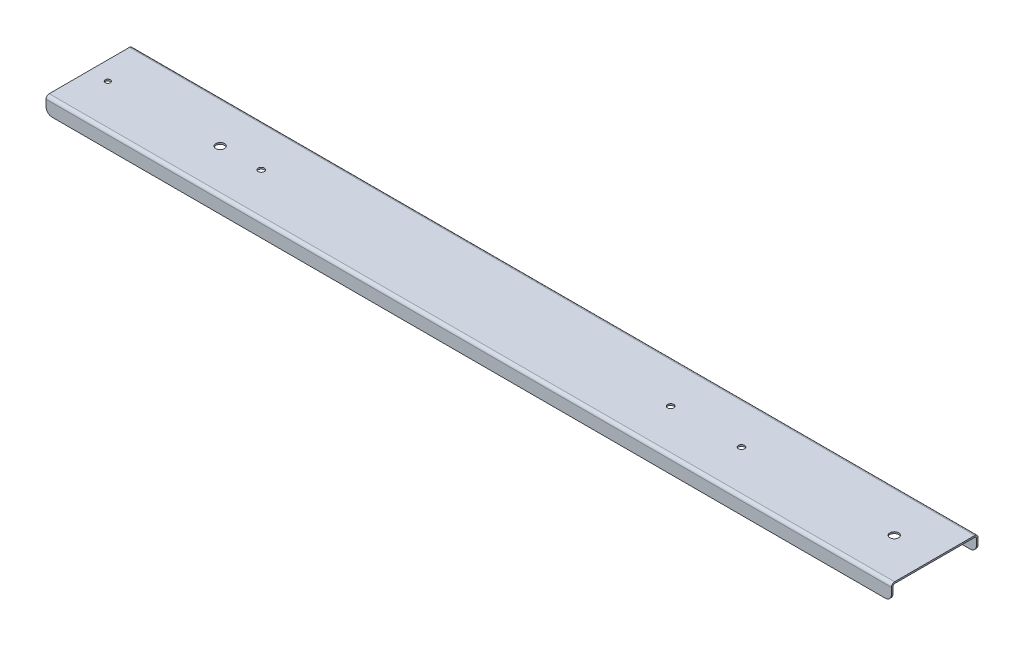
ISO-10303-21;
HEADER;
FILE_DESCRIPTION(('STEP AP214'),'2;1');
FILE_NAME('part.step','',(''),(''),'','','');
FILE_SCHEMA(('AUTOMOTIVE_DESIGN { 1 0 10303 214 1 1 1 1 }'));
ENDSEC;
DATA;
#1=APPLICATION_CONTEXT('core data for automotive mechanical design processes');
#2=APPLICATION_PROTOCOL_DEFINITION('international standard','automotive_design',2000,#1);
#3=PRODUCT_CONTEXT('',#1,'mechanical');
#4=PRODUCT('Part','Part','',(#3));
#5=PRODUCT_RELATED_PRODUCT_CATEGORY('part','',(#4));
#6=PRODUCT_DEFINITION_FORMATION('','',#4);
#7=PRODUCT_DEFINITION_CONTEXT('part definition',#1,'design');
#8=PRODUCT_DEFINITION('design','',#6,#7);
#9=PRODUCT_DEFINITION_SHAPE('','',#8);
#10=(LENGTH_UNIT() NAMED_UNIT(*) SI_UNIT(.MILLI.,.METRE.));
#11=(NAMED_UNIT(*) PLANE_ANGLE_UNIT() SI_UNIT($,.RADIAN.));
#12=(NAMED_UNIT(*) SI_UNIT($,.STERADIAN.) SOLID_ANGLE_UNIT());
#13=UNCERTAINTY_MEASURE_WITH_UNIT(LENGTH_MEASURE(1.E-05),#10,'distance_accuracy_value','');
#14=(GEOMETRIC_REPRESENTATION_CONTEXT(3) GLOBAL_UNCERTAINTY_ASSIGNED_CONTEXT((#13)) GLOBAL_UNIT_ASSIGNED_CONTEXT((#10,
#11,#12)) REPRESENTATION_CONTEXT('',''));
#15=CARTESIAN_POINT('',(0.,0.,0.));
#16=DIRECTION('',(0.,0.,1.));
#17=DIRECTION('',(1.,0.,0.));
#18=AXIS2_PLACEMENT_3D('',#15,#16,#17);
#19=CARTESIAN_POINT('',(290.49780007,-64.262,0.));
#20=DIRECTION('',(0.,1.,0.));
#21=DIRECTION('',(0.,0.,1.));
#22=AXIS2_PLACEMENT_3D('',#19,#20,#21);
#23=CYLINDRICAL_SURFACE('',#22,3.51);
#24=CARTESIAN_POINT('',(290.49780007,-1.291,0.));
#25=DIRECTION('',(0.,-1.,0.));
#26=DIRECTION('',(0.,0.,-1.));
#27=AXIS2_PLACEMENT_3D('',#24,#25,#26);
#28=CIRCLE('',#27,3.51);
#29=CARTESIAN_POINT('',(290.49780007,-1.291,-3.51));
#30=VERTEX_POINT('',#29);
#31=EDGE_CURVE('E359',#30,#30,#28,.T.);
#32=ORIENTED_EDGE('',*,*,#31,.T.);
#33=EDGE_LOOP('',(#32));
#34=FACE_BOUND('',#33,.T.);
#35=CARTESIAN_POINT('',(290.49780007,0.,0.));
#36=DIRECTION('',(0.,1.,0.));
#37=DIRECTION('',(0.,0.,1.));
#38=AXIS2_PLACEMENT_3D('',#35,#36,#37);
#39=CIRCLE('',#38,3.51);
#40=CARTESIAN_POINT('',(290.49780007,0.,3.51));
#41=VERTEX_POINT('',#40);
#42=EDGE_CURVE('E363',#41,#41,#39,.T.);
#43=ORIENTED_EDGE('',*,*,#42,.T.);
#44=EDGE_LOOP('',(#43));
#45=FACE_BOUND('',#44,.T.);
#46=ADVANCED_FACE('F50',(#34,#45),#23,.F.);
#47=CARTESIAN_POINT('',(-253.22220012,-64.262,0.));
#48=DIRECTION('',(0.,1.,0.));
#49=DIRECTION('',(0.,0.,1.));
#50=AXIS2_PLACEMENT_3D('',#47,#48,#49);
#51=CYLINDRICAL_SURFACE('',#50,3.51);
#52=CARTESIAN_POINT('',(-253.22220012,-1.291,0.));
#53=DIRECTION('',(0.,-1.,0.));
#54=DIRECTION('',(0.,0.,-1.));
#55=AXIS2_PLACEMENT_3D('',#52,#53,#54);
#56=CIRCLE('',#55,3.51);
#57=CARTESIAN_POINT('',(-253.22220012,-1.291,-3.51));
#58=VERTEX_POINT('',#57);
#59=EDGE_CURVE('E355',#58,#58,#56,.T.);
#60=ORIENTED_EDGE('',*,*,#59,.T.);
#61=EDGE_LOOP('',(#60));
#62=FACE_BOUND('',#61,.T.);
#63=CARTESIAN_POINT('',(-253.22220012,0.,0.));
#64=DIRECTION('',(0.,1.,0.));
#65=DIRECTION('',(0.,0.,1.));
#66=AXIS2_PLACEMENT_3D('',#63,#64,#65);
#67=CIRCLE('',#66,3.51);
#68=CARTESIAN_POINT('',(-253.22220012,0.,3.51));
#69=VERTEX_POINT('',#68);
#70=EDGE_CURVE('E329',#69,#69,#67,.T.);
#71=ORIENTED_EDGE('',*,*,#70,.T.);
#72=EDGE_LOOP('',(#71));
#73=FACE_BOUND('',#72,.T.);
#74=ADVANCED_FACE('F563',(#62,#73),#51,.F.);
#75=CARTESIAN_POINT('',(-353.775,-7.7,34.925));
#76=DIRECTION('',(0.,0.,-1.));
#77=DIRECTION('',(0.,1.,0.));
#78=AXIS2_PLACEMENT_3D('',#75,#76,#77);
#79=CYLINDRICAL_SURFACE('',#78,5.);
#80=CARTESIAN_POINT('',(-353.775,-7.7,34.925));
#81=DIRECTION('',(0.,0.,1.));
#82=DIRECTION('',(0.,-1.,0.));
#83=AXIS2_PLACEMENT_3D('',#80,#81,#82);
#84=CIRCLE('',#83,5.);
#85=CARTESIAN_POINT('',(-358.775,-7.7,34.925));
#86=VERTEX_POINT('',#85);
#87=CARTESIAN_POINT('',(-353.775,-12.7,34.925));
#88=VERTEX_POINT('',#87);
#89=EDGE_CURVE('E257',#86,#88,#84,.T.);
#90=ORIENTED_EDGE('',*,*,#89,.F.);
#91=DIRECTION('',(0.,0.,1.));
#92=VECTOR('',#91,1.);
#93=CARTESIAN_POINT('',(-358.775,-7.7,34.925));
#94=LINE('',#93,#92);
#95=CARTESIAN_POINT('',(-358.775,-7.7,33.634));
#96=VERTEX_POINT('',#95);
#97=EDGE_CURVE('E277',#96,#86,#94,.T.);
#98=ORIENTED_EDGE('',*,*,#97,.F.);
#99=CARTESIAN_POINT('',(-353.775,-7.7,33.634));
#100=DIRECTION('',(0.,0.,-1.));
#101=DIRECTION('',(0.,-1.,0.));
#102=AXIS2_PLACEMENT_3D('',#99,#100,#101);
#103=CIRCLE('',#102,5.);
#104=CARTESIAN_POINT('',(-353.775,-12.7,33.634));
#105=VERTEX_POINT('',#104);
#106=EDGE_CURVE('E244',#105,#96,#103,.T.);
#107=ORIENTED_EDGE('',*,*,#106,.F.);
#108=DIRECTION('',(0.,0.,-1.));
#109=VECTOR('',#108,1.);
#110=CARTESIAN_POINT('',(-353.775,-12.7,34.925));
#111=LINE('',#110,#109);
#112=EDGE_CURVE('E237',#88,#105,#111,.T.);
#113=ORIENTED_EDGE('',*,*,#112,.F.);
#114=EDGE_LOOP('',(#90,#98,#107,#113));
#115=FACE_BOUND('',#114,.T.);
#116=ADVANCED_FACE('F569',(#115),#79,.T.);
#117=CARTESIAN_POINT('',(-353.775,-7.7,-34.925));
#118=DIRECTION('',(0.,0.,1.));
#119=DIRECTION('',(0.,-1.,0.));
#120=AXIS2_PLACEMENT_3D('',#117,#118,#119);
#121=CYLINDRICAL_SURFACE('',#120,5.);
#122=CARTESIAN_POINT('',(-353.775,-7.7,-34.925));
#123=DIRECTION('',(0.,0.,-1.));
#124=DIRECTION('',(0.,1.,0.));
#125=AXIS2_PLACEMENT_3D('',#122,#123,#124);
#126=CIRCLE('',#125,5.);
#127=CARTESIAN_POINT('',(-353.775,-12.7,-34.925));
#128=VERTEX_POINT('',#127);
#129=CARTESIAN_POINT('',(-358.775,-7.7,-34.925));
#130=VERTEX_POINT('',#129);
#131=EDGE_CURVE('E159',#128,#130,#126,.T.);
#132=ORIENTED_EDGE('',*,*,#131,.F.);
#133=DIRECTION('',(0.,0.,-1.));
#134=VECTOR('',#133,1.);
#135=CARTESIAN_POINT('',(-353.775,-12.7,-34.925));
#136=LINE('',#135,#134);
#137=CARTESIAN_POINT('',(-353.775,-12.7,-33.634));
#138=VERTEX_POINT('',#137);
#139=EDGE_CURVE('E146',#138,#128,#136,.T.);
#140=ORIENTED_EDGE('',*,*,#139,.F.);
#141=CARTESIAN_POINT('',(-353.775,-7.7,-33.634));
#142=DIRECTION('',(0.,0.,1.));
#143=DIRECTION('',(0.,1.,0.));
#144=AXIS2_PLACEMENT_3D('',#141,#142,#143);
#145=CIRCLE('',#144,5.);
#146=CARTESIAN_POINT('',(-358.775,-7.7,-33.634));
#147=VERTEX_POINT('',#146);
#148=EDGE_CURVE('E183',#147,#138,#145,.T.);
#149=ORIENTED_EDGE('',*,*,#148,.F.);
#150=DIRECTION('',(0.,0.,1.));
#151=VECTOR('',#150,1.);
#152=CARTESIAN_POINT('',(-358.775,-7.7,-34.925));
#153=LINE('',#152,#151);
#154=EDGE_CURVE('E162',#130,#147,#153,.T.);
#155=ORIENTED_EDGE('',*,*,#154,.F.);
#156=EDGE_LOOP('',(#132,#140,#149,#155));
#157=FACE_BOUND('',#156,.T.);
#158=ADVANCED_FACE('F160',(#157),#121,.T.);
#159=CARTESIAN_POINT('',(318.088,-7.70000000000025,-38.1));
#160=DIRECTION('',(0.,0.,1.));
#161=DIRECTION('',(0.,-1.,0.));
#162=AXIS2_PLACEMENT_3D('',#159,#160,#161);
#163=CYLINDRICAL_SURFACE('',#162,5.);
#164=CARTESIAN_POINT('',(318.088,-7.7,34.925));
#165=DIRECTION('',(0.,0.,1.));
#166=DIRECTION('',(0.,-1.,0.));
#167=AXIS2_PLACEMENT_3D('',#164,#165,#166);
#168=CIRCLE('',#167,5.);
#169=CARTESIAN_POINT('',(318.088,-12.7,34.925));
#170=VERTEX_POINT('',#169);
#171=CARTESIAN_POINT('',(323.088,-7.7,34.925));
#172=VERTEX_POINT('',#171);
#173=EDGE_CURVE('E265',#170,#172,#168,.T.);
#174=ORIENTED_EDGE('',*,*,#173,.F.);
#175=DIRECTION('',(0.,0.,1.));
#176=VECTOR('',#175,1.);
#177=CARTESIAN_POINT('',(318.088,-12.7,34.925));
#178=LINE('',#177,#176);
#179=CARTESIAN_POINT('',(318.088,-12.7,33.634));
#180=VERTEX_POINT('',#179);
#181=EDGE_CURVE('E241',#180,#170,#178,.T.);
#182=ORIENTED_EDGE('',*,*,#181,.F.);
#183=CARTESIAN_POINT('',(318.088,-7.7,33.634));
#184=DIRECTION('',(0.,0.,-1.));
#185=DIRECTION('',(0.,-1.,0.));
#186=AXIS2_PLACEMENT_3D('',#183,#184,#185);
#187=CIRCLE('',#186,5.);
#188=CARTESIAN_POINT('',(323.088,-7.7,33.634));
#189=VERTEX_POINT('',#188);
#190=EDGE_CURVE('E252',#189,#180,#187,.T.);
#191=ORIENTED_EDGE('',*,*,#190,.F.);
#192=DIRECTION('',(0.,0.,-1.));
#193=VECTOR('',#192,1.);
#194=CARTESIAN_POINT('',(323.088,-7.7,33.634));
#195=LINE('',#194,#193);
#196=EDGE_CURVE('E11',#172,#189,#195,.T.);
#197=ORIENTED_EDGE('',*,*,#196,.F.);
#198=EDGE_LOOP('',(#174,#182,#191,#197));
#199=FACE_BOUND('',#198,.T.);
#200=ADVANCED_FACE('F546',(#199),#163,.T.);
#201=CARTESIAN_POINT('',(318.088,-7.7,-38.1));
#202=DIRECTION('',(0.,0.,1.));
#203=DIRECTION('',(0.,-1.,0.));
#204=AXIS2_PLACEMENT_3D('',#201,#202,#203);
#205=CYLINDRICAL_SURFACE('',#204,5.);
#206=CARTESIAN_POINT('',(318.088,-7.7,-33.634));
#207=DIRECTION('',(0.,0.,1.));
#208=DIRECTION('',(0.,1.,0.));
#209=AXIS2_PLACEMENT_3D('',#206,#207,#208);
#210=CIRCLE('',#209,5.);
#211=CARTESIAN_POINT('',(318.088,-12.7,-33.634));
#212=VERTEX_POINT('',#211);
#213=CARTESIAN_POINT('',(323.088,-7.7,-33.634));
#214=VERTEX_POINT('',#213);
#215=EDGE_CURVE('E184',#212,#214,#210,.T.);
#216=ORIENTED_EDGE('',*,*,#215,.F.);
#217=DIRECTION('',(0.,0.,1.));
#218=VECTOR('',#217,1.);
#219=CARTESIAN_POINT('',(318.088,-12.7,-33.634));
#220=LINE('',#219,#218);
#221=CARTESIAN_POINT('',(318.088,-12.7,-34.925));
#222=VERTEX_POINT('',#221);
#223=EDGE_CURVE('E85',#222,#212,#220,.T.);
#224=ORIENTED_EDGE('',*,*,#223,.F.);
#225=CARTESIAN_POINT('',(318.088,-7.7,-34.925));
#226=DIRECTION('',(0.,0.,-1.));
#227=DIRECTION('',(0.,1.,0.));
#228=AXIS2_PLACEMENT_3D('',#225,#226,#227);
#229=CIRCLE('',#228,5.);
#230=CARTESIAN_POINT('',(323.088,-7.7,-34.925));
#231=VERTEX_POINT('',#230);
#232=EDGE_CURVE('E169',#231,#222,#229,.T.);
#233=ORIENTED_EDGE('',*,*,#232,.F.);
#234=DIRECTION('',(0.,0.,-1.));
#235=VECTOR('',#234,1.);
#236=CARTESIAN_POINT('',(323.088,-7.7,-34.925));
#237=LINE('',#236,#235);
#238=EDGE_CURVE('E59',#214,#231,#237,.T.);
#239=ORIENTED_EDGE('',*,*,#238,.F.);
#240=EDGE_LOOP('',(#216,#224,#233,#239));
#241=FACE_BOUND('',#240,.T.);
#242=ADVANCED_FACE('F197',(#241),#205,.T.);
#243=CARTESIAN_POINT('',(110.105000008,0.,0.));
#244=DIRECTION('',(0.,1.,0.));
#245=DIRECTION('',(0.,0.,1.));
#246=AXIS2_PLACEMENT_3D('',#243,#244,#245);
#247=CYLINDRICAL_SURFACE('',#246,2.4892);
#248=CARTESIAN_POINT('',(110.105000008,-1.291,0.));
#249=DIRECTION('',(0.,-1.,0.));
#250=DIRECTION('',(0.,0.,-1.));
#251=AXIS2_PLACEMENT_3D('',#248,#249,#250);
#252=CIRCLE('',#251,2.4892);
#253=CARTESIAN_POINT('',(110.105000008,-1.291,-2.4892));
#254=VERTEX_POINT('',#253);
#255=EDGE_CURVE('E353',#254,#254,#252,.T.);
#256=ORIENTED_EDGE('',*,*,#255,.T.);
#257=EDGE_LOOP('',(#256));
#258=FACE_BOUND('',#257,.T.);
#259=CARTESIAN_POINT('',(110.105000008,0.,0.));
#260=DIRECTION('',(0.,1.,0.));
#261=DIRECTION('',(0.,0.,1.));
#262=AXIS2_PLACEMENT_3D('',#259,#260,#261);
#263=CIRCLE('',#262,2.4892);
#264=CARTESIAN_POINT('',(110.105000008,0.,2.4892));
#265=VERTEX_POINT('',#264);
#266=EDGE_CURVE('E325',#265,#265,#263,.T.);
#267=ORIENTED_EDGE('',*,*,#266,.T.);
#268=EDGE_LOOP('',(#267));
#269=FACE_BOUND('',#268,.T.);
#270=ADVANCED_FACE('F734',(#258,#269),#247,.F.);
#271=CARTESIAN_POINT('',(167.255000008,0.,0.));
#272=DIRECTION('',(0.,1.,0.));
#273=DIRECTION('',(0.,0.,1.));
#274=AXIS2_PLACEMENT_3D('',#271,#272,#273);
#275=CYLINDRICAL_SURFACE('',#274,2.4892);
#276=CARTESIAN_POINT('',(167.255000008,-1.291,0.));
#277=DIRECTION('',(0.,-1.,0.));
#278=DIRECTION('',(0.,0.,-1.));
#279=AXIS2_PLACEMENT_3D('',#276,#277,#278);
#280=CIRCLE('',#279,2.4892);
#281=CARTESIAN_POINT('',(167.255000008,-1.291,-2.4892));
#282=VERTEX_POINT('',#281);
#283=EDGE_CURVE('E346',#282,#282,#280,.T.);
#284=ORIENTED_EDGE('',*,*,#283,.T.);
#285=EDGE_LOOP('',(#284));
#286=FACE_BOUND('',#285,.T.);
#287=CARTESIAN_POINT('',(167.255000008,0.,0.));
#288=DIRECTION('',(0.,1.,0.));
#289=DIRECTION('',(0.,0.,1.));
#290=AXIS2_PLACEMENT_3D('',#287,#288,#289);
#291=CIRCLE('',#290,2.4892);
#292=CARTESIAN_POINT('',(167.255000008,0.,2.4892));
#293=VERTEX_POINT('',#292);
#294=EDGE_CURVE('E319',#293,#293,#291,.T.);
#295=ORIENTED_EDGE('',*,*,#294,.T.);
#296=EDGE_LOOP('',(#295));
#297=FACE_BOUND('',#296,.T.);
#298=ADVANCED_FACE('F723',(#286,#297),#275,.F.);
#299=CARTESIAN_POINT('',(-220.094999992,0.,0.));
#300=DIRECTION('',(0.,1.,0.));
#301=DIRECTION('',(0.,0.,1.));
#302=AXIS2_PLACEMENT_3D('',#299,#300,#301);
#303=CYLINDRICAL_SURFACE('',#302,2.4892);
#304=CARTESIAN_POINT('',(-220.094999992,-1.291,0.));
#305=DIRECTION('',(0.,-1.,0.));
#306=DIRECTION('',(0.,0.,-1.));
#307=AXIS2_PLACEMENT_3D('',#304,#305,#306);
#308=CIRCLE('',#307,2.4892);
#309=CARTESIAN_POINT('',(-220.094999992,-1.291,-2.48919999999996));
#310=VERTEX_POINT('',#309);
#311=EDGE_CURVE('E335',#310,#310,#308,.T.);
#312=ORIENTED_EDGE('',*,*,#311,.T.);
#313=EDGE_LOOP('',(#312));
#314=FACE_BOUND('',#313,.T.);
#315=CARTESIAN_POINT('',(-220.094999992,0.,0.));
#316=DIRECTION('',(0.,1.,0.));
#317=DIRECTION('',(0.,0.,1.));
#318=AXIS2_PLACEMENT_3D('',#315,#316,#317);
#319=CIRCLE('',#318,2.4892);
#320=CARTESIAN_POINT('',(-220.094999992,0.,2.48920000000004));
#321=VERTEX_POINT('',#320);
#322=EDGE_CURVE('E315',#321,#321,#319,.T.);
#323=ORIENTED_EDGE('',*,*,#322,.T.);
#324=EDGE_LOOP('',(#323));
#325=FACE_BOUND('',#324,.T.);
#326=ADVANCED_FACE('F713',(#314,#325),#303,.F.);
#327=CARTESIAN_POINT('',(323.088,0.,-38.1));
#328=DIRECTION('',(-1.,0.,0.));
#329=DIRECTION('',(0.,0.,1.));
#330=AXIS2_PLACEMENT_3D('',#327,#328,#329);
#331=PLANE('',#330);
#332=DIRECTION('',(0.,1.,0.));
#333=VECTOR('',#332,1.);
#334=CARTESIAN_POINT('',(323.088,1.27447209883755E-13,-33.634));
#335=LINE('',#334,#333);
#336=CARTESIAN_POINT('',(323.088,-2.582,-33.634));
#337=VERTEX_POINT('',#336);
#338=EDGE_CURVE('E180',#214,#337,#335,.T.);
#339=ORIENTED_EDGE('',*,*,#338,.F.);
#340=ORIENTED_EDGE('',*,*,#238,.T.);
#341=DIRECTION('',(0.,1.,0.));
#342=VECTOR('',#341,1.);
#343=CARTESIAN_POINT('',(323.088,1.31954712292201E-13,-34.925));
#344=LINE('',#343,#342);
#345=CARTESIAN_POINT('',(323.088,-2.582,-34.925));
#346=VERTEX_POINT('',#345);
#347=EDGE_CURVE('E175',#231,#346,#344,.T.);
#348=ORIENTED_EDGE('',*,*,#347,.T.);
#349=CARTESIAN_POINT('',(323.088,-2.582,-32.343));
#350=DIRECTION('',(1.,0.,0.));
#351=DIRECTION('',(0.,0.,1.));
#352=AXIS2_PLACEMENT_3D('',#349,#350,#351);
#353=CIRCLE('',#352,2.582);
#354=CARTESIAN_POINT('',(323.088,0.,-32.343));
#355=VERTEX_POINT('',#354);
#356=EDGE_CURVE('E221',#346,#355,#353,.T.);
#357=ORIENTED_EDGE('',*,*,#356,.T.);
#358=DIRECTION('',(0.,0.,-1.));
#359=VECTOR('',#358,1.);
#360=CARTESIAN_POINT('',(323.088,0.,-38.1));
#361=LINE('',#360,#359);
#362=CARTESIAN_POINT('',(323.088,0.,32.343));
#363=VERTEX_POINT('',#362);
#364=EDGE_CURVE('E334',#363,#355,#361,.T.);
#365=ORIENTED_EDGE('',*,*,#364,.F.);
#366=CARTESIAN_POINT('',(323.088,-2.582,32.343));
#367=DIRECTION('',(1.,0.,0.));
#368=DIRECTION('',(0.,0.,1.));
#369=AXIS2_PLACEMENT_3D('',#366,#367,#368);
#370=CIRCLE('',#369,2.582);
#371=CARTESIAN_POINT('',(323.088,-2.582,34.925));
#372=VERTEX_POINT('',#371);
#373=EDGE_CURVE('E291',#363,#372,#370,.T.);
#374=ORIENTED_EDGE('',*,*,#373,.T.);
#375=DIRECTION('',(0.,-1.,0.));
#376=VECTOR('',#375,1.);
#377=CARTESIAN_POINT('',(323.088,1.31954712292201E-13,34.925));
#378=LINE('',#377,#376);
#379=EDGE_CURVE('E261',#372,#172,#378,.T.);
#380=ORIENTED_EDGE('',*,*,#379,.T.);
#381=ORIENTED_EDGE('',*,*,#196,.T.);
#382=DIRECTION('',(0.,-1.,0.));
#383=VECTOR('',#382,1.);
#384=CARTESIAN_POINT('',(323.088,1.27447209883755E-13,33.634));
#385=LINE('',#384,#383);
#386=CARTESIAN_POINT('',(323.088,-2.582,33.634));
#387=VERTEX_POINT('',#386);
#388=EDGE_CURVE('E253',#387,#189,#385,.T.);
#389=ORIENTED_EDGE('',*,*,#388,.F.);
#390=CARTESIAN_POINT('',(323.088,-2.582,32.343));
#391=DIRECTION('',(1.,0.,0.));
#392=DIRECTION('',(0.,0.,1.));
#393=AXIS2_PLACEMENT_3D('',#390,#391,#392);
#394=CIRCLE('',#393,1.291);
#395=CARTESIAN_POINT('',(323.088,-1.291,32.343));
#396=VERTEX_POINT('',#395);
#397=EDGE_CURVE('E286',#396,#387,#394,.T.);
#398=ORIENTED_EDGE('',*,*,#397,.F.);
#399=DIRECTION('',(0.,0.,-1.));
#400=VECTOR('',#399,1.);
#401=CARTESIAN_POINT('',(323.088,-1.291,0.));
#402=LINE('',#401,#400);
#403=CARTESIAN_POINT('',(323.088,-1.291,-32.343));
#404=VERTEX_POINT('',#403);
#405=EDGE_CURVE('E391',#396,#404,#402,.T.);
#406=ORIENTED_EDGE('',*,*,#405,.T.);
#407=CARTESIAN_POINT('',(323.088,-2.582,-32.343));
#408=DIRECTION('',(1.,0.,0.));
#409=DIRECTION('',(0.,0.,1.));
#410=AXIS2_PLACEMENT_3D('',#407,#408,#409);
#411=CIRCLE('',#410,1.291);
#412=EDGE_CURVE('E217',#337,#404,#411,.T.);
#413=ORIENTED_EDGE('',*,*,#412,.F.);
#414=EDGE_LOOP('',(#339,#340,#348,#357,#365,#374,#380,#381,#389,#398,#406,#413));
#415=FACE_BOUND('',#414,.T.);
#416=ADVANCED_FACE('F192',(#415),#331,.F.);
#417=CARTESIAN_POINT('',(358.775,-12.7,-34.925));
#418=DIRECTION('',(0.,-1.,0.));
#419=DIRECTION('',(0.,0.,-1.));
#420=AXIS2_PLACEMENT_3D('',#417,#418,#419);
#421=PLANE('',#420);
#422=DIRECTION('',(1.,0.,0.));
#423=VECTOR('',#422,1.);
#424=CARTESIAN_POINT('',(358.775,-12.7,-34.925));
#425=LINE('',#424,#423);
#426=EDGE_CURVE('E150',#128,#222,#425,.T.);
#427=ORIENTED_EDGE('',*,*,#426,.T.);
#428=ORIENTED_EDGE('',*,*,#223,.T.);
#429=DIRECTION('',(1.,0.,0.));
#430=VECTOR('',#429,1.);
#431=CARTESIAN_POINT('',(0.,-12.7,-33.634));
#432=LINE('',#431,#430);
#433=EDGE_CURVE('E153',#138,#212,#432,.T.);
#434=ORIENTED_EDGE('',*,*,#433,.F.);
#435=ORIENTED_EDGE('',*,*,#139,.T.);
#436=EDGE_LOOP('',(#427,#428,#434,#435));
#437=FACE_BOUND('',#436,.T.);
#438=ADVANCED_FACE('F148',(#437),#421,.T.);
#439=CARTESIAN_POINT('',(0.,1.27447209883755E-13,-33.634));
#440=DIRECTION('',(0.,0.,-1.));
#441=DIRECTION('',(-1.,0.,0.));
#442=AXIS2_PLACEMENT_3D('',#439,#440,#441);
#443=PLANE('',#442);
#444=ORIENTED_EDGE('',*,*,#433,.T.);
#445=ORIENTED_EDGE('',*,*,#215,.T.);
#446=ORIENTED_EDGE('',*,*,#338,.T.);
#447=DIRECTION('',(1.,0.,0.));
#448=VECTOR('',#447,1.);
#449=CARTESIAN_POINT('',(-358.775,-2.582,-33.634));
#450=LINE('',#449,#448);
#451=CARTESIAN_POINT('',(-358.775,-2.582,-33.634));
#452=VERTEX_POINT('',#451);
#453=EDGE_CURVE('E220',#452,#337,#450,.T.);
#454=ORIENTED_EDGE('',*,*,#453,.F.);
#455=DIRECTION('',(0.,-1.,0.));
#456=VECTOR('',#455,1.);
#457=CARTESIAN_POINT('',(-358.775,-5.10947450533963E-12,-33.634));
#458=LINE('',#457,#456);
#459=EDGE_CURVE('E202',#452,#147,#458,.T.);
#460=ORIENTED_EDGE('',*,*,#459,.T.);
#461=ORIENTED_EDGE('',*,*,#148,.T.);
#462=EDGE_LOOP('',(#444,#445,#446,#454,#460,#461));
#463=FACE_BOUND('',#462,.T.);
#464=ADVANCED_FACE('F685',(#463),#443,.F.);
#465=CARTESIAN_POINT('',(0.,1.31954712292201E-13,-34.925));
#466=DIRECTION('',(0.,0.,-1.));
#467=DIRECTION('',(-1.,0.,0.));
#468=AXIS2_PLACEMENT_3D('',#465,#466,#467);
#469=PLANE('',#468);
#470=ORIENTED_EDGE('',*,*,#347,.F.);
#471=ORIENTED_EDGE('',*,*,#232,.T.);
#472=ORIENTED_EDGE('',*,*,#426,.F.);
#473=ORIENTED_EDGE('',*,*,#131,.T.);
#474=DIRECTION('',(0.,-1.,0.));
#475=VECTOR('',#474,1.);
#476=CARTESIAN_POINT('',(-358.775,-12.7,-34.925));
#477=LINE('',#476,#475);
#478=CARTESIAN_POINT('',(-358.775,-2.582,-34.925));
#479=VERTEX_POINT('',#478);
#480=EDGE_CURVE('E212',#479,#130,#477,.T.);
#481=ORIENTED_EDGE('',*,*,#480,.F.);
#482=DIRECTION('',(1.,0.,0.));
#483=VECTOR('',#482,1.);
#484=CARTESIAN_POINT('',(0.,-2.582,-34.925));
#485=LINE('',#484,#483);
#486=EDGE_CURVE('E199',#479,#346,#485,.T.);
#487=ORIENTED_EDGE('',*,*,#486,.T.);
#488=EDGE_LOOP('',(#470,#471,#472,#473,#481,#487));
#489=FACE_BOUND('',#488,.T.);
#490=ADVANCED_FACE('F168',(#489),#469,.T.);
#491=CARTESIAN_POINT('',(-358.775,-12.7,-34.925));
#492=DIRECTION('',(-1.,0.,0.));
#493=DIRECTION('',(0.,1.,0.));
#494=AXIS2_PLACEMENT_3D('',#491,#492,#493);
#495=PLANE('',#494);
#496=ORIENTED_EDGE('',*,*,#480,.T.);
#497=ORIENTED_EDGE('',*,*,#154,.T.);
#498=ORIENTED_EDGE('',*,*,#459,.F.);
#499=DIRECTION('',(0.,0.,-1.));
#500=VECTOR('',#499,1.);
#501=CARTESIAN_POINT('',(-358.775,-2.582,-34.925));
#502=LINE('',#501,#500);
#503=EDGE_CURVE('E234',#452,#479,#502,.T.);
#504=ORIENTED_EDGE('',*,*,#503,.T.);
#505=EDGE_LOOP('',(#496,#497,#498,#504));
#506=FACE_BOUND('',#505,.T.);
#507=ADVANCED_FACE('F665',(#506),#495,.T.);
#508=CARTESIAN_POINT('',(358.775,-2.582,-32.343));
#509=DIRECTION('',(1.,0.,0.));
#510=DIRECTION('',(0.,0.,-1.));
#511=AXIS2_PLACEMENT_3D('',#508,#509,#510);
#512=CYLINDRICAL_SURFACE('',#511,1.291);
#513=ORIENTED_EDGE('',*,*,#453,.T.);
#514=ORIENTED_EDGE('',*,*,#412,.T.);
#515=DIRECTION('',(-1.,0.,0.));
#516=VECTOR('',#515,1.);
#517=CARTESIAN_POINT('',(358.775,-1.291,-32.343));
#518=LINE('',#517,#516);
#519=CARTESIAN_POINT('',(-358.775,-1.291,-32.343));
#520=VERTEX_POINT('',#519);
#521=EDGE_CURVE('E370',#404,#520,#518,.T.);
#522=ORIENTED_EDGE('',*,*,#521,.T.);
#523=CARTESIAN_POINT('',(-358.775,-2.582,-32.343));
#524=DIRECTION('',(-1.,0.,0.));
#525=DIRECTION('',(0.,0.,-1.));
#526=AXIS2_PLACEMENT_3D('',#523,#524,#525);
#527=CIRCLE('',#526,1.291);
#528=EDGE_CURVE('E230',#520,#452,#527,.T.);
#529=ORIENTED_EDGE('',*,*,#528,.T.);
#530=EDGE_LOOP('',(#513,#514,#522,#529));
#531=FACE_BOUND('',#530,.T.);
#532=ADVANCED_FACE('F654',(#531),#512,.F.);
#533=CARTESIAN_POINT('',(358.775,-2.582,-32.343));
#534=DIRECTION('',(1.,0.,0.));
#535=DIRECTION('',(0.,0.,-1.));
#536=AXIS2_PLACEMENT_3D('',#533,#534,#535);
#537=CYLINDRICAL_SURFACE('',#536,2.582);
#538=ORIENTED_EDGE('',*,*,#356,.F.);
#539=ORIENTED_EDGE('',*,*,#486,.F.);
#540=CARTESIAN_POINT('',(-358.775,-2.582,-32.343));
#541=DIRECTION('',(-1.,0.,0.));
#542=DIRECTION('',(0.,0.,-1.));
#543=AXIS2_PLACEMENT_3D('',#540,#541,#542);
#544=CIRCLE('',#543,2.582);
#545=CARTESIAN_POINT('',(-358.775,0.,-32.343));
#546=VERTEX_POINT('',#545);
#547=EDGE_CURVE('E224',#546,#479,#544,.T.);
#548=ORIENTED_EDGE('',*,*,#547,.F.);
#549=DIRECTION('',(-1.,0.,0.));
#550=VECTOR('',#549,1.);
#551=CARTESIAN_POINT('',(358.775,0.,-32.343));
#552=LINE('',#551,#550);
#553=EDGE_CURVE('E342',#355,#546,#552,.T.);
#554=ORIENTED_EDGE('',*,*,#553,.F.);
#555=EDGE_LOOP('',(#538,#539,#548,#554));
#556=FACE_BOUND('',#555,.T.);
#557=ADVANCED_FACE('F642',(#556),#537,.T.);
#558=CARTESIAN_POINT('',(-358.775,-2.582,-32.343));
#559=DIRECTION('',(-1.,0.,0.));
#560=DIRECTION('',(0.,0.,1.));
#561=AXIS2_PLACEMENT_3D('',#558,#559,#560);
#562=PLANE('',#561);
#563=ORIENTED_EDGE('',*,*,#503,.F.);
#564=ORIENTED_EDGE('',*,*,#528,.F.);
#565=DIRECTION('',(0.,1.,0.));
#566=VECTOR('',#565,1.);
#567=CARTESIAN_POINT('',(-358.775,-1.291,-32.343));
#568=LINE('',#567,#566);
#569=EDGE_CURVE('E311',#520,#546,#568,.T.);
#570=ORIENTED_EDGE('',*,*,#569,.T.);
#571=ORIENTED_EDGE('',*,*,#547,.T.);
#572=EDGE_LOOP('',(#563,#564,#570,#571));
#573=FACE_BOUND('',#572,.T.);
#574=ADVANCED_FACE('F637',(#573),#562,.T.);
#575=CARTESIAN_POINT('',(-358.775,-12.7,34.925));
#576=DIRECTION('',(0.,-1.,0.));
#577=DIRECTION('',(-1.,0.,0.));
#578=AXIS2_PLACEMENT_3D('',#575,#576,#577);
#579=PLANE('',#578);
#580=DIRECTION('',(-1.,0.,0.));
#581=VECTOR('',#580,1.);
#582=CARTESIAN_POINT('',(0.,-12.7,33.634));
#583=LINE('',#582,#581);
#584=EDGE_CURVE('E248',#180,#105,#583,.T.);
#585=ORIENTED_EDGE('',*,*,#584,.F.);
#586=ORIENTED_EDGE('',*,*,#181,.T.);
#587=DIRECTION('',(-1.,0.,0.));
#588=VECTOR('',#587,1.);
#589=CARTESIAN_POINT('',(-358.775,-12.7,34.925));
#590=LINE('',#589,#588);
#591=EDGE_CURVE('E269',#170,#88,#590,.T.);
#592=ORIENTED_EDGE('',*,*,#591,.T.);
#593=ORIENTED_EDGE('',*,*,#112,.T.);
#594=EDGE_LOOP('',(#585,#586,#592,#593));
#595=FACE_BOUND('',#594,.T.);
#596=ADVANCED_FACE('F542',(#595),#579,.T.);
#597=CARTESIAN_POINT('',(0.,1.27447209883755E-13,33.634));
#598=DIRECTION('',(0.,0.,1.));
#599=DIRECTION('',(0.,-1.,0.));
#600=AXIS2_PLACEMENT_3D('',#597,#598,#599);
#601=PLANE('',#600);
#602=ORIENTED_EDGE('',*,*,#388,.T.);
#603=ORIENTED_EDGE('',*,*,#190,.T.);
#604=ORIENTED_EDGE('',*,*,#584,.T.);
#605=ORIENTED_EDGE('',*,*,#106,.T.);
#606=DIRECTION('',(0.,1.,0.));
#607=VECTOR('',#606,1.);
#608=CARTESIAN_POINT('',(-358.775,-3.3638339335985E-12,33.634));
#609=LINE('',#608,#607);
#610=CARTESIAN_POINT('',(-358.775,-2.582,33.634));
#611=VERTEX_POINT('',#610);
#612=EDGE_CURVE('E281',#96,#611,#609,.T.);
#613=ORIENTED_EDGE('',*,*,#612,.T.);
#614=DIRECTION('',(-1.,0.,0.));
#615=VECTOR('',#614,1.);
#616=CARTESIAN_POINT('',(358.775,-2.582,33.634));
#617=LINE('',#616,#615);
#618=EDGE_CURVE('E282',#387,#611,#617,.T.);
#619=ORIENTED_EDGE('',*,*,#618,.F.);
#620=EDGE_LOOP('',(#602,#603,#604,#605,#613,#619));
#621=FACE_BOUND('',#620,.T.);
#622=ADVANCED_FACE('F549',(#621),#601,.F.);
#623=CARTESIAN_POINT('',(0.,1.31954712292201E-13,34.925));
#624=DIRECTION('',(0.,0.,1.));
#625=DIRECTION('',(0.,-1.,0.));
#626=AXIS2_PLACEMENT_3D('',#623,#624,#625);
#627=PLANE('',#626);
#628=ORIENTED_EDGE('',*,*,#591,.F.);
#629=ORIENTED_EDGE('',*,*,#173,.T.);
#630=ORIENTED_EDGE('',*,*,#379,.F.);
#631=DIRECTION('',(-1.,0.,0.));
#632=VECTOR('',#631,1.);
#633=CARTESIAN_POINT('',(0.,-2.582,34.925));
#634=LINE('',#633,#632);
#635=CARTESIAN_POINT('',(-358.775,-2.582,34.925));
#636=VERTEX_POINT('',#635);
#637=EDGE_CURVE('E287',#372,#636,#634,.T.);
#638=ORIENTED_EDGE('',*,*,#637,.T.);
#639=DIRECTION('',(0.,1.,0.));
#640=VECTOR('',#639,1.);
#641=CARTESIAN_POINT('',(-358.775,-1.291,34.925));
#642=LINE('',#641,#640);
#643=EDGE_CURVE('E273',#86,#636,#642,.T.);
#644=ORIENTED_EDGE('',*,*,#643,.F.);
#645=ORIENTED_EDGE('',*,*,#89,.T.);
#646=EDGE_LOOP('',(#628,#629,#630,#638,#644,#645));
#647=FACE_BOUND('',#646,.T.);
#648=ADVANCED_FACE('F516',(#647),#627,.T.);
#649=CARTESIAN_POINT('',(-358.775,-1.291,34.925));
#650=DIRECTION('',(-1.,0.,0.));
#651=DIRECTION('',(0.,1.,0.));
#652=AXIS2_PLACEMENT_3D('',#649,#650,#651);
#653=PLANE('',#652);
#654=ORIENTED_EDGE('',*,*,#612,.F.);
#655=ORIENTED_EDGE('',*,*,#97,.T.);
#656=ORIENTED_EDGE('',*,*,#643,.T.);
#657=DIRECTION('',(0.,0.,1.));
#658=VECTOR('',#657,1.);
#659=CARTESIAN_POINT('',(-358.775,-2.582,33.634));
#660=LINE('',#659,#658);
#661=EDGE_CURVE('E299',#611,#636,#660,.T.);
#662=ORIENTED_EDGE('',*,*,#661,.F.);
#663=EDGE_LOOP('',(#654,#655,#656,#662));
#664=FACE_BOUND('',#663,.T.);
#665=ADVANCED_FACE('F537',(#664),#653,.T.);
#666=CARTESIAN_POINT('',(-358.775,-2.582,32.343));
#667=DIRECTION('',(-1.,0.,0.));
#668=DIRECTION('',(0.,0.,1.));
#669=AXIS2_PLACEMENT_3D('',#666,#667,#668);
#670=CYLINDRICAL_SURFACE('',#669,1.291);
#671=DIRECTION('',(1.,0.,0.));
#672=VECTOR('',#671,1.);
#673=CARTESIAN_POINT('',(-358.775,-1.29099999999999,32.343));
#674=LINE('',#673,#672);
#675=CARTESIAN_POINT('',(-358.775,-1.291,32.343));
#676=VERTEX_POINT('',#675);
#677=EDGE_CURVE('E381',#676,#396,#674,.T.);
#678=ORIENTED_EDGE('',*,*,#677,.T.);
#679=ORIENTED_EDGE('',*,*,#397,.T.);
#680=ORIENTED_EDGE('',*,*,#618,.T.);
#681=CARTESIAN_POINT('',(-358.775,-2.582,32.343));
#682=DIRECTION('',(-1.,0.,0.));
#683=DIRECTION('',(0.,0.,1.));
#684=AXIS2_PLACEMENT_3D('',#681,#682,#683);
#685=CIRCLE('',#684,1.291);
#686=EDGE_CURVE('E303',#611,#676,#685,.T.);
#687=ORIENTED_EDGE('',*,*,#686,.T.);
#688=EDGE_LOOP('',(#678,#679,#680,#687));
#689=FACE_BOUND('',#688,.T.);
#690=ADVANCED_FACE('F551',(#689),#670,.F.);
#691=CARTESIAN_POINT('',(-358.775,-2.582,32.343));
#692=DIRECTION('',(-1.,0.,0.));
#693=DIRECTION('',(0.,0.,1.));
#694=AXIS2_PLACEMENT_3D('',#691,#692,#693);
#695=CYLINDRICAL_SURFACE('',#694,2.582);
#696=ORIENTED_EDGE('',*,*,#373,.F.);
#697=DIRECTION('',(1.,0.,0.));
#698=VECTOR('',#697,1.);
#699=CARTESIAN_POINT('',(-358.775,0.,32.343));
#700=LINE('',#699,#698);
#701=CARTESIAN_POINT('',(-358.775,0.,32.343));
#702=VERTEX_POINT('',#701);
#703=EDGE_CURVE('E330',#702,#363,#700,.T.);
#704=ORIENTED_EDGE('',*,*,#703,.F.);
#705=CARTESIAN_POINT('',(-358.775,-2.582,32.343));
#706=DIRECTION('',(-1.,0.,0.));
#707=DIRECTION('',(0.,0.,1.));
#708=AXIS2_PLACEMENT_3D('',#705,#706,#707);
#709=CIRCLE('',#708,2.582);
#710=EDGE_CURVE('E295',#636,#702,#709,.T.);
#711=ORIENTED_EDGE('',*,*,#710,.F.);
#712=ORIENTED_EDGE('',*,*,#637,.F.);
#713=EDGE_LOOP('',(#696,#704,#711,#712));
#714=FACE_BOUND('',#713,.T.);
#715=ADVANCED_FACE('F521',(#714),#695,.T.);
#716=CARTESIAN_POINT('',(-358.775,-2.582,32.343));
#717=DIRECTION('',(1.,0.,0.));
#718=DIRECTION('',(0.,1.,0.));
#719=AXIS2_PLACEMENT_3D('',#716,#717,#718);
#720=PLANE('',#719);
#721=ORIENTED_EDGE('',*,*,#686,.F.);
#722=ORIENTED_EDGE('',*,*,#661,.T.);
#723=ORIENTED_EDGE('',*,*,#710,.T.);
#724=DIRECTION('',(0.,1.,0.));
#725=VECTOR('',#724,1.);
#726=CARTESIAN_POINT('',(-358.775,-1.29099999999999,32.343));
#727=LINE('',#726,#725);
#728=EDGE_CURVE('E307',#676,#702,#727,.T.);
#729=ORIENTED_EDGE('',*,*,#728,.F.);
#730=EDGE_LOOP('',(#721,#722,#723,#729));
#731=FACE_BOUND('',#730,.T.);
#732=ADVANCED_FACE('F533',(#731),#720,.F.);
#733=CARTESIAN_POINT('',(-358.775,-1.291,34.925));
#734=DIRECTION('',(-1.,0.,0.));
#735=DIRECTION('',(0.,0.,1.));
#736=AXIS2_PLACEMENT_3D('',#733,#734,#735);
#737=PLANE('',#736);
#738=ORIENTED_EDGE('',*,*,#569,.F.);
#739=DIRECTION('',(0.,0.,1.));
#740=VECTOR('',#739,1.);
#741=CARTESIAN_POINT('',(-358.775,-1.291,34.925));
#742=LINE('',#741,#740);
#743=EDGE_CURVE('E377',#520,#676,#742,.T.);
#744=ORIENTED_EDGE('',*,*,#743,.T.);
#745=ORIENTED_EDGE('',*,*,#728,.T.);
#746=DIRECTION('',(0.,0.,1.));
#747=VECTOR('',#746,1.);
#748=CARTESIAN_POINT('',(-358.775,0.,34.925));
#749=LINE('',#748,#747);
#750=EDGE_CURVE('E350',#546,#702,#749,.T.);
#751=ORIENTED_EDGE('',*,*,#750,.F.);
#752=EDGE_LOOP('',(#738,#744,#745,#751));
#753=FACE_BOUND('',#752,.T.);
#754=ADVANCED_FACE('F529',(#753),#737,.T.);
#755=CARTESIAN_POINT('',(0.,0.,0.));
#756=DIRECTION('',(0.,-1.,0.));
#757=DIRECTION('',(0.,0.,-1.));
#758=AXIS2_PLACEMENT_3D('',#755,#756,#757);
#759=PLANE('',#758);
#760=CARTESIAN_POINT('',(-343.775,0.,0.));
#761=DIRECTION('',(0.,1.,0.));
#762=DIRECTION('',(0.,0.,1.));
#763=AXIS2_PLACEMENT_3D('',#760,#761,#762);
#764=CIRCLE('',#763,2.09999999999999);
#765=CARTESIAN_POINT('',(-343.775,0.,2.09999999999999));
#766=VERTEX_POINT('',#765);
#767=EDGE_CURVE('E404',#766,#766,#764,.T.);
#768=ORIENTED_EDGE('',*,*,#767,.F.);
#769=EDGE_LOOP('',(#768));
#770=FACE_BOUND('',#769,.T.);
#771=ORIENTED_EDGE('',*,*,#322,.F.);
#772=EDGE_LOOP('',(#771));
#773=FACE_BOUND('',#772,.T.);
#774=ORIENTED_EDGE('',*,*,#294,.F.);
#775=EDGE_LOOP('',(#774));
#776=FACE_BOUND('',#775,.T.);
#777=ORIENTED_EDGE('',*,*,#266,.F.);
#778=EDGE_LOOP('',(#777));
#779=FACE_BOUND('',#778,.T.);
#780=ORIENTED_EDGE('',*,*,#70,.F.);
#781=EDGE_LOOP('',(#780));
#782=FACE_BOUND('',#781,.T.);
#783=ORIENTED_EDGE('',*,*,#42,.F.);
#784=EDGE_LOOP('',(#783));
#785=FACE_BOUND('',#784,.T.);
#786=ORIENTED_EDGE('',*,*,#703,.T.);
#787=ORIENTED_EDGE('',*,*,#364,.T.);
#788=ORIENTED_EDGE('',*,*,#553,.T.);
#789=ORIENTED_EDGE('',*,*,#750,.T.);
#790=EDGE_LOOP('',(#786,#787,#788,#789));
#791=FACE_BOUND('',#790,.T.);
#792=ADVANCED_FACE('F416',(#770,#773,#776,#779,#782,#785,#791),#759,.F.);
#793=CARTESIAN_POINT('',(0.,-1.291,0.));
#794=DIRECTION('',(0.,-1.,0.));
#795=DIRECTION('',(0.,0.,-1.));
#796=AXIS2_PLACEMENT_3D('',#793,#794,#795);
#797=PLANE('',#796);
#798=CARTESIAN_POINT('',(-343.775,-1.291,0.));
#799=DIRECTION('',(0.,-1.,0.));
#800=DIRECTION('',(0.,0.,-1.));
#801=AXIS2_PLACEMENT_3D('',#798,#799,#800);
#802=CIRCLE('',#801,2.09999999999999);
#803=CARTESIAN_POINT('',(-343.775,-1.291,-2.09999999999999));
#804=VERTEX_POINT('',#803);
#805=EDGE_CURVE('E53',#804,#804,#802,.T.);
#806=ORIENTED_EDGE('',*,*,#805,.F.);
#807=EDGE_LOOP('',(#806));
#808=FACE_BOUND('',#807,.T.);
#809=ORIENTED_EDGE('',*,*,#311,.F.);
#810=EDGE_LOOP('',(#809));
#811=FACE_BOUND('',#810,.T.);
#812=ORIENTED_EDGE('',*,*,#283,.F.);
#813=EDGE_LOOP('',(#812));
#814=FACE_BOUND('',#813,.T.);
#815=ORIENTED_EDGE('',*,*,#255,.F.);
#816=EDGE_LOOP('',(#815));
#817=FACE_BOUND('',#816,.T.);
#818=ORIENTED_EDGE('',*,*,#59,.F.);
#819=EDGE_LOOP('',(#818));
#820=FACE_BOUND('',#819,.T.);
#821=ORIENTED_EDGE('',*,*,#31,.F.);
#822=EDGE_LOOP('',(#821));
#823=FACE_BOUND('',#822,.T.);
#824=ORIENTED_EDGE('',*,*,#405,.F.);
#825=ORIENTED_EDGE('',*,*,#677,.F.);
#826=ORIENTED_EDGE('',*,*,#743,.F.);
#827=ORIENTED_EDGE('',*,*,#521,.F.);
#828=EDGE_LOOP('',(#824,#825,#826,#827));
#829=FACE_BOUND('',#828,.T.);
#830=ADVANCED_FACE('F413',(#808,#811,#814,#817,#820,#823,#829),#797,.T.);
#831=CARTESIAN_POINT('',(-343.775,-10.,0.));
#832=DIRECTION('',(0.,1.,0.));
#833=DIRECTION('',(0.,0.,1.));
#834=AXIS2_PLACEMENT_3D('',#831,#832,#833);
#835=CYLINDRICAL_SURFACE('',#834,2.09999999999999);
#836=ORIENTED_EDGE('',*,*,#805,.T.);
#837=EDGE_LOOP('',(#836));
#838=FACE_BOUND('',#837,.T.);
#839=ORIENTED_EDGE('',*,*,#767,.T.);
#840=EDGE_LOOP('',(#839));
#841=FACE_BOUND('',#840,.T.);
#842=ADVANCED_FACE('F411',(#838,#841),#835,.F.);
#843=CLOSED_SHELL('',(#46,#74,#116,#158,#200,#242,#270,#298,#326,#416,#438,#464,#490,#507,#532,
#557,#574,#596,#622,#648,#665,#690,#715,#732,#754,#792,#830,#842));
#844=MANIFOLD_SOLID_BREP('B2',#843);
#845=ADVANCED_BREP_SHAPE_REPRESENTATION('',(#18,#844),#14);
#846=SHAPE_DEFINITION_REPRESENTATION(#9,#845);
ENDSEC;
END-ISO-10303-21;
